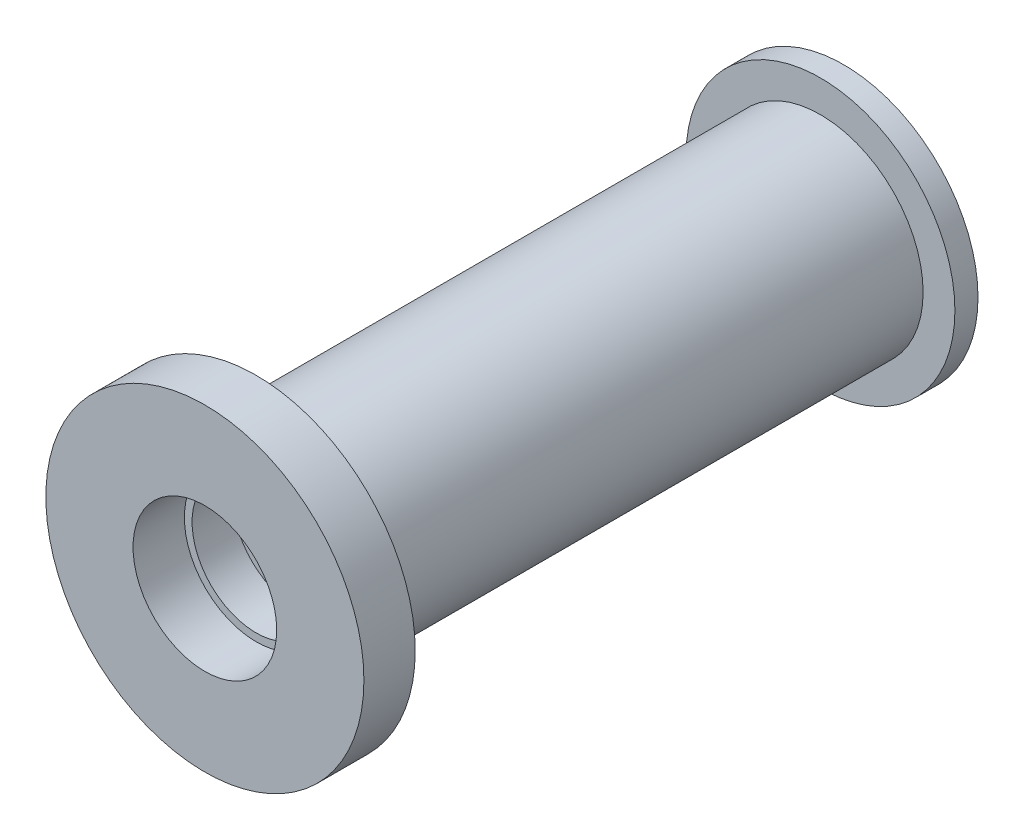
ISO-10303-21;
HEADER;
FILE_DESCRIPTION(('STEP AP214'),'2;1');
FILE_NAME('part.step','',(''),(''),'','','');
FILE_SCHEMA(('AUTOMOTIVE_DESIGN { 1 0 10303 214 1 1 1 1 }'));
ENDSEC;
DATA;
#1=APPLICATION_CONTEXT('core data for automotive mechanical design processes');
#2=APPLICATION_PROTOCOL_DEFINITION('international standard','automotive_design',2000,#1);
#3=PRODUCT_CONTEXT('',#1,'mechanical');
#4=PRODUCT('Part','Part','',(#3));
#5=PRODUCT_RELATED_PRODUCT_CATEGORY('part','',(#4));
#6=PRODUCT_DEFINITION_FORMATION('','',#4);
#7=PRODUCT_DEFINITION_CONTEXT('part definition',#1,'design');
#8=PRODUCT_DEFINITION('design','',#6,#7);
#9=PRODUCT_DEFINITION_SHAPE('','',#8);
#10=(LENGTH_UNIT() NAMED_UNIT(*) SI_UNIT(.MILLI.,.METRE.));
#11=(NAMED_UNIT(*) PLANE_ANGLE_UNIT() SI_UNIT($,.RADIAN.));
#12=(NAMED_UNIT(*) SI_UNIT($,.STERADIAN.) SOLID_ANGLE_UNIT());
#13=UNCERTAINTY_MEASURE_WITH_UNIT(LENGTH_MEASURE(1.E-05),#10,'distance_accuracy_value','');
#14=(GEOMETRIC_REPRESENTATION_CONTEXT(3) GLOBAL_UNCERTAINTY_ASSIGNED_CONTEXT((#13)) GLOBAL_UNIT_ASSIGNED_CONTEXT((#10,
#11,#12)) REPRESENTATION_CONTEXT('',''));
#15=CARTESIAN_POINT('',(0.,0.,0.));
#16=DIRECTION('',(0.,0.,1.));
#17=DIRECTION('',(1.,0.,0.));
#18=AXIS2_PLACEMENT_3D('',#15,#16,#17);
#19=CARTESIAN_POINT('',(0.,0.,11.));
#20=DIRECTION('',(0.,0.,-1.));
#21=DIRECTION('',(-1.,0.,0.));
#22=AXIS2_PLACEMENT_3D('',#19,#20,#21);
#23=CYLINDRICAL_SURFACE('',#22,1.1);
#24=CARTESIAN_POINT('',(0.,0.,-0.45));
#25=DIRECTION('',(0.,0.,1.));
#26=DIRECTION('',(1.,0.,0.));
#27=AXIS2_PLACEMENT_3D('',#24,#25,#26);
#28=CIRCLE('',#27,1.1);
#29=CARTESIAN_POINT('',(1.1,0.,-0.45));
#30=VERTEX_POINT('',#29);
#31=EDGE_CURVE('E76',#30,#30,#28,.T.);
#32=ORIENTED_EDGE('',*,*,#31,.F.);
#33=EDGE_LOOP('',(#32));
#34=FACE_BOUND('',#33,.T.);
#35=CARTESIAN_POINT('',(0.,0.,10.2));
#36=DIRECTION('',(0.,0.,1.));
#37=DIRECTION('',(1.,0.,0.));
#38=AXIS2_PLACEMENT_3D('',#35,#36,#37);
#39=CIRCLE('',#38,1.1);
#40=CARTESIAN_POINT('',(1.1,0.,10.2));
#41=VERTEX_POINT('',#40);
#42=EDGE_CURVE('E54',#41,#41,#39,.T.);
#43=ORIENTED_EDGE('',*,*,#42,.T.);
#44=EDGE_LOOP('',(#43));
#45=FACE_BOUND('',#44,.T.);
#46=ADVANCED_FACE('F40',(#34,#45),#23,.F.);
#47=CARTESIAN_POINT('',(0.,0.,11.));
#48=DIRECTION('',(0.,0.,1.));
#49=DIRECTION('',(1.,0.,0.));
#50=AXIS2_PLACEMENT_3D('',#47,#48,#49);
#51=PLANE('',#50);
#52=CARTESIAN_POINT('',(0.,0.,11.));
#53=DIRECTION('',(0.,0.,1.));
#54=DIRECTION('',(1.,0.,0.));
#55=AXIS2_PLACEMENT_3D('',#52,#53,#54);
#56=CIRCLE('',#55,1.25);
#57=CARTESIAN_POINT('',(1.25,0.,11.));
#58=VERTEX_POINT('',#57);
#59=EDGE_CURVE('E41',#58,#58,#56,.F.);
#60=ORIENTED_EDGE('',*,*,#59,.T.);
#61=EDGE_LOOP('',(#60));
#62=FACE_BOUND('',#61,.T.);
#63=CARTESIAN_POINT('',(0.,0.,11.));
#64=DIRECTION('',(0.,0.,1.));
#65=DIRECTION('',(1.,0.,0.));
#66=AXIS2_PLACEMENT_3D('',#63,#64,#65);
#67=CIRCLE('',#66,1.4);
#68=CARTESIAN_POINT('',(1.4,0.,11.));
#69=VERTEX_POINT('',#68);
#70=EDGE_CURVE('E61',#69,#69,#67,.T.);
#71=ORIENTED_EDGE('',*,*,#70,.T.);
#72=EDGE_LOOP('',(#71));
#73=FACE_BOUND('',#72,.T.);
#74=ADVANCED_FACE('F96',(#62,#73),#51,.T.);
#75=CARTESIAN_POINT('',(0.,0.,11.));
#76=DIRECTION('',(0.,0.,-1.));
#77=DIRECTION('',(-1.,0.,0.));
#78=AXIS2_PLACEMENT_3D('',#75,#76,#77);
#79=CYLINDRICAL_SURFACE('',#78,2.);
#80=CARTESIAN_POINT('',(0.,0.,11.));
#81=DIRECTION('',(0.,0.,1.));
#82=DIRECTION('',(1.,0.,0.));
#83=AXIS2_PLACEMENT_3D('',#80,#81,#82);
#84=CIRCLE('',#83,2.);
#85=CARTESIAN_POINT('',(2.,0.,11.));
#86=VERTEX_POINT('',#85);
#87=EDGE_CURVE('E10',#86,#86,#84,.T.);
#88=ORIENTED_EDGE('',*,*,#87,.F.);
#89=EDGE_LOOP('',(#88));
#90=FACE_BOUND('',#89,.T.);
#91=CARTESIAN_POINT('',(0.,0.,0.));
#92=DIRECTION('',(0.,0.,1.));
#93=DIRECTION('',(1.,0.,0.));
#94=AXIS2_PLACEMENT_3D('',#91,#92,#93);
#95=CIRCLE('',#94,2.);
#96=CARTESIAN_POINT('',(2.,0.,0.));
#97=VERTEX_POINT('',#96);
#98=EDGE_CURVE('E44',#97,#97,#95,.T.);
#99=ORIENTED_EDGE('',*,*,#98,.T.);
#100=EDGE_LOOP('',(#99));
#101=FACE_BOUND('',#100,.T.);
#102=ADVANCED_FACE('F39',(#90,#101),#79,.T.);
#103=CARTESIAN_POINT('',(0.,0.,0.));
#104=DIRECTION('',(0.,0.,1.));
#105=DIRECTION('',(1.,0.,0.));
#106=AXIS2_PLACEMENT_3D('',#103,#104,#105);
#107=PLANE('',#106);
#108=ORIENTED_EDGE('',*,*,#98,.F.);
#109=EDGE_LOOP('',(#108));
#110=FACE_BOUND('',#109,.T.);
#111=CARTESIAN_POINT('',(0.,0.,0.));
#112=DIRECTION('',(0.,0.,1.));
#113=DIRECTION('',(1.,0.,0.));
#114=AXIS2_PLACEMENT_3D('',#111,#112,#113);
#115=CIRCLE('',#114,2.62);
#116=CARTESIAN_POINT('',(2.62,0.,0.));
#117=VERTEX_POINT('',#116);
#118=EDGE_CURVE('E49',#117,#117,#115,.T.);
#119=ORIENTED_EDGE('',*,*,#118,.T.);
#120=EDGE_LOOP('',(#119));
#121=FACE_BOUND('',#120,.T.);
#122=ADVANCED_FACE('F93',(#110,#121),#107,.T.);
#123=CARTESIAN_POINT('',(0.,0.,-0.45));
#124=DIRECTION('',(0.,0.,1.));
#125=DIRECTION('',(1.,0.,0.));
#126=AXIS2_PLACEMENT_3D('',#123,#124,#125);
#127=PLANE('',#126);
#128=CARTESIAN_POINT('',(0.,0.,-0.45));
#129=DIRECTION('',(0.,0.,1.));
#130=DIRECTION('',(1.,0.,0.));
#131=AXIS2_PLACEMENT_3D('',#128,#129,#130);
#132=CIRCLE('',#131,2.62);
#133=CARTESIAN_POINT('',(2.62,0.,-0.45));
#134=VERTEX_POINT('',#133);
#135=EDGE_CURVE('E52',#134,#134,#132,.T.);
#136=ORIENTED_EDGE('',*,*,#135,.F.);
#137=EDGE_LOOP('',(#136));
#138=FACE_BOUND('',#137,.T.);
#139=ORIENTED_EDGE('',*,*,#31,.T.);
#140=EDGE_LOOP('',(#139));
#141=FACE_BOUND('',#140,.T.);
#142=ADVANCED_FACE('F86',(#138,#141),#127,.F.);
#143=CARTESIAN_POINT('',(0.,0.,0.));
#144=DIRECTION('',(0.,0.,-1.));
#145=DIRECTION('',(-1.,0.,0.));
#146=AXIS2_PLACEMENT_3D('',#143,#144,#145);
#147=CYLINDRICAL_SURFACE('',#146,2.62);
#148=ORIENTED_EDGE('',*,*,#118,.F.);
#149=EDGE_LOOP('',(#148));
#150=FACE_BOUND('',#149,.T.);
#151=ORIENTED_EDGE('',*,*,#135,.T.);
#152=EDGE_LOOP('',(#151));
#153=FACE_BOUND('',#152,.T.);
#154=ADVANCED_FACE('F88',(#150,#153),#147,.T.);
#155=CARTESIAN_POINT('',(0.,0.,11.));
#156=DIRECTION('',(0.,0.,1.));
#157=DIRECTION('',(1.,0.,0.));
#158=AXIS2_PLACEMENT_3D('',#155,#156,#157);
#159=PLANE('',#158);
#160=CARTESIAN_POINT('',(0.,0.,11.));
#161=DIRECTION('',(0.,0.,1.));
#162=DIRECTION('',(1.,0.,0.));
#163=AXIS2_PLACEMENT_3D('',#160,#161,#162);
#164=CIRCLE('',#163,3.1);
#165=CARTESIAN_POINT('',(3.1,0.,11.));
#166=VERTEX_POINT('',#165);
#167=EDGE_CURVE('E69',#166,#166,#164,.T.);
#168=ORIENTED_EDGE('',*,*,#167,.F.);
#169=EDGE_LOOP('',(#168));
#170=FACE_BOUND('',#169,.T.);
#171=ORIENTED_EDGE('',*,*,#87,.T.);
#172=EDGE_LOOP('',(#171));
#173=FACE_BOUND('',#172,.T.);
#174=ADVANCED_FACE('F104',(#170,#173),#159,.F.);
#175=CARTESIAN_POINT('',(0.,0.,12.));
#176=DIRECTION('',(0.,0.,1.));
#177=DIRECTION('',(1.,0.,0.));
#178=AXIS2_PLACEMENT_3D('',#175,#176,#177);
#179=PLANE('',#178);
#180=CARTESIAN_POINT('',(0.,0.,12.));
#181=DIRECTION('',(0.,0.,1.));
#182=DIRECTION('',(1.,0.,0.));
#183=AXIS2_PLACEMENT_3D('',#180,#181,#182);
#184=CIRCLE('',#183,3.1);
#185=CARTESIAN_POINT('',(3.1,0.,12.));
#186=VERTEX_POINT('',#185);
#187=EDGE_CURVE('E71',#186,#186,#184,.T.);
#188=ORIENTED_EDGE('',*,*,#187,.T.);
#189=EDGE_LOOP('',(#188));
#190=FACE_BOUND('',#189,.T.);
#191=CARTESIAN_POINT('',(0.,0.,12.));
#192=DIRECTION('',(0.,0.,1.));
#193=DIRECTION('',(1.,0.,0.));
#194=AXIS2_PLACEMENT_3D('',#191,#192,#193);
#195=CIRCLE('',#194,1.4);
#196=CARTESIAN_POINT('',(1.4,0.,12.));
#197=VERTEX_POINT('',#196);
#198=EDGE_CURVE('E70',#197,#197,#195,.T.);
#199=ORIENTED_EDGE('',*,*,#198,.F.);
#200=EDGE_LOOP('',(#199));
#201=FACE_BOUND('',#200,.T.);
#202=ADVANCED_FACE('F113',(#190,#201),#179,.T.);
#203=CARTESIAN_POINT('',(0.,0.,12.));
#204=DIRECTION('',(0.,0.,-1.));
#205=DIRECTION('',(-1.,0.,0.));
#206=AXIS2_PLACEMENT_3D('',#203,#204,#205);
#207=CYLINDRICAL_SURFACE('',#206,3.1);
#208=ORIENTED_EDGE('',*,*,#187,.F.);
#209=EDGE_LOOP('',(#208));
#210=FACE_BOUND('',#209,.T.);
#211=ORIENTED_EDGE('',*,*,#167,.T.);
#212=EDGE_LOOP('',(#211));
#213=FACE_BOUND('',#212,.T.);
#214=ADVANCED_FACE('F112',(#210,#213),#207,.T.);
#215=CARTESIAN_POINT('',(0.,0.,12.));
#216=DIRECTION('',(0.,0.,-1.));
#217=DIRECTION('',(-1.,0.,0.));
#218=AXIS2_PLACEMENT_3D('',#215,#216,#217);
#219=CYLINDRICAL_SURFACE('',#218,1.4);
#220=ORIENTED_EDGE('',*,*,#198,.T.);
#221=EDGE_LOOP('',(#220));
#222=FACE_BOUND('',#221,.T.);
#223=ORIENTED_EDGE('',*,*,#70,.F.);
#224=EDGE_LOOP('',(#223));
#225=FACE_BOUND('',#224,.T.);
#226=ADVANCED_FACE('F111',(#222,#225),#219,.F.);
#227=CARTESIAN_POINT('',(0.,0.,11.1));
#228=DIRECTION('',(0.,0.,-1.));
#229=DIRECTION('',(-1.,0.,0.));
#230=AXIS2_PLACEMENT_3D('',#227,#228,#229);
#231=CYLINDRICAL_SURFACE('',#230,1.25);
#232=ORIENTED_EDGE('',*,*,#59,.F.);
#233=EDGE_LOOP('',(#232));
#234=FACE_BOUND('',#233,.T.);
#235=CARTESIAN_POINT('',(0.,0.,10.2));
#236=DIRECTION('',(0.,0.,1.));
#237=DIRECTION('',(1.,0.,0.));
#238=AXIS2_PLACEMENT_3D('',#235,#236,#237);
#239=CIRCLE('',#238,1.25);
#240=CARTESIAN_POINT('',(1.25,0.,10.2));
#241=VERTEX_POINT('',#240);
#242=EDGE_CURVE('E60',#241,#241,#239,.T.);
#243=ORIENTED_EDGE('',*,*,#242,.F.);
#244=EDGE_LOOP('',(#243));
#245=FACE_BOUND('',#244,.T.);
#246=ADVANCED_FACE('F122',(#234,#245),#231,.F.);
#247=CARTESIAN_POINT('',(0.,0.,10.2));
#248=DIRECTION('',(0.,0.,1.));
#249=DIRECTION('',(1.,0.,0.));
#250=AXIS2_PLACEMENT_3D('',#247,#248,#249);
#251=PLANE('',#250);
#252=ORIENTED_EDGE('',*,*,#42,.F.);
#253=EDGE_LOOP('',(#252));
#254=FACE_BOUND('',#253,.T.);
#255=ORIENTED_EDGE('',*,*,#242,.T.);
#256=EDGE_LOOP('',(#255));
#257=FACE_BOUND('',#256,.T.);
#258=ADVANCED_FACE('F126',(#254,#257),#251,.T.);
#259=CLOSED_SHELL('',(#46,#74,#102,#122,#142,#154,#174,#202,#214,#226,#246,#258));
#260=MANIFOLD_SOLID_BREP('B2',#259);
#261=ADVANCED_BREP_SHAPE_REPRESENTATION('',(#18,#260),#14);
#262=SHAPE_DEFINITION_REPRESENTATION(#9,#261);
ENDSEC;
END-ISO-10303-21;
